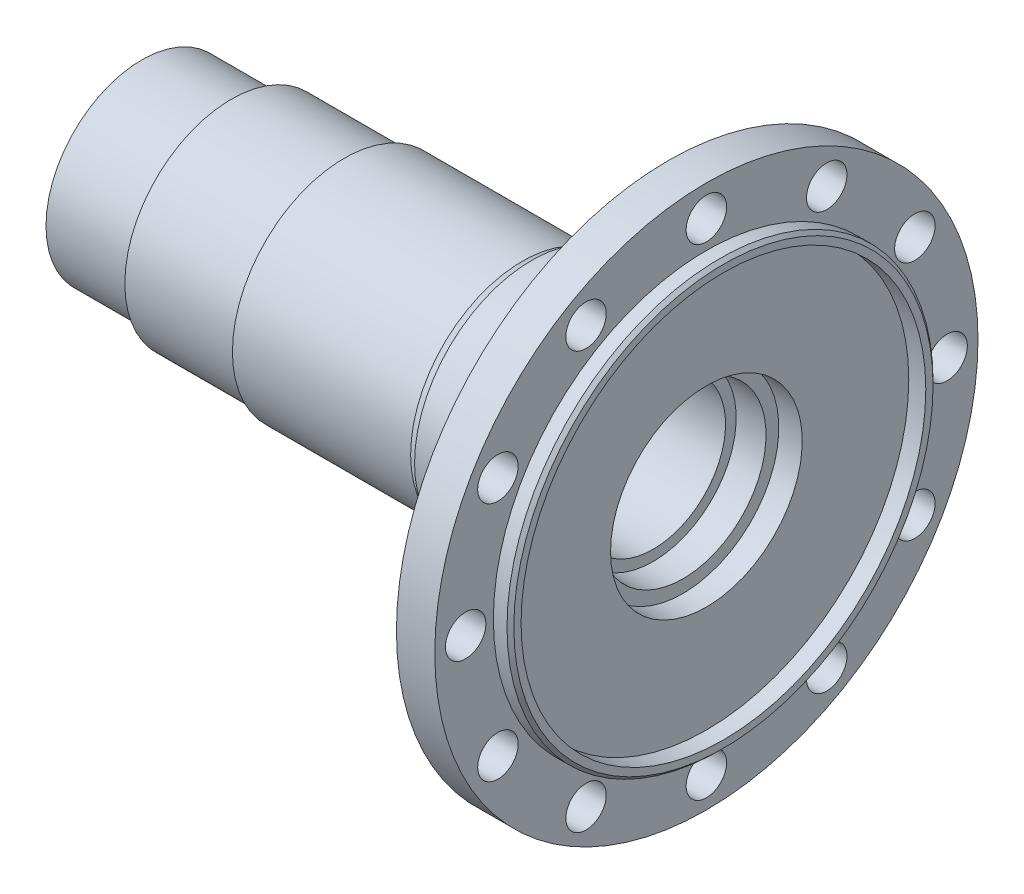
ISO-10303-21;
HEADER;
FILE_DESCRIPTION(('STEP AP214'),'2;1');
FILE_NAME('part.step','',(''),(''),'','','');
FILE_SCHEMA(('AUTOMOTIVE_DESIGN { 1 0 10303 214 1 1 1 1 }'));
ENDSEC;
DATA;
#1=APPLICATION_CONTEXT('core data for automotive mechanical design processes');
#2=APPLICATION_PROTOCOL_DEFINITION('international standard','automotive_design',2000,#1);
#3=PRODUCT_CONTEXT('',#1,'mechanical');
#4=PRODUCT('Part','Part','',(#3));
#5=PRODUCT_RELATED_PRODUCT_CATEGORY('part','',(#4));
#6=PRODUCT_DEFINITION_FORMATION('','',#4);
#7=PRODUCT_DEFINITION_CONTEXT('part definition',#1,'design');
#8=PRODUCT_DEFINITION('design','',#6,#7);
#9=PRODUCT_DEFINITION_SHAPE('','',#8);
#10=(LENGTH_UNIT() NAMED_UNIT(*) SI_UNIT(.MILLI.,.METRE.));
#11=(NAMED_UNIT(*) PLANE_ANGLE_UNIT() SI_UNIT($,.RADIAN.));
#12=(NAMED_UNIT(*) SI_UNIT($,.STERADIAN.) SOLID_ANGLE_UNIT());
#13=UNCERTAINTY_MEASURE_WITH_UNIT(LENGTH_MEASURE(1.E-05),#10,'distance_accuracy_value','');
#14=(GEOMETRIC_REPRESENTATION_CONTEXT(3) GLOBAL_UNCERTAINTY_ASSIGNED_CONTEXT((#13)) GLOBAL_UNIT_ASSIGNED_CONTEXT((#10,
#11,#12)) REPRESENTATION_CONTEXT('',''));
#15=CARTESIAN_POINT('',(0.,0.,0.));
#16=DIRECTION('',(0.,0.,1.));
#17=DIRECTION('',(1.,0.,0.));
#18=AXIS2_PLACEMENT_3D('',#15,#16,#17);
#19=CARTESIAN_POINT('',(0.,0.,0.));
#20=DIRECTION('',(1.,0.,0.));
#21=DIRECTION('',(0.,0.,-1.));
#22=AXIS2_PLACEMENT_3D('',#19,#20,#21);
#23=PLANE('',#22);
#24=CARTESIAN_POINT('',(0.,0.,0.));
#25=DIRECTION('',(-1.,0.,0.));
#26=DIRECTION('',(0.,0.,1.));
#27=AXIS2_PLACEMENT_3D('',#24,#25,#26);
#28=CIRCLE('',#27,31.);
#29=CARTESIAN_POINT('',(0.,0.,31.));
#30=VERTEX_POINT('',#29);
#31=EDGE_CURVE('E158',#30,#30,#28,.T.);
#32=ORIENTED_EDGE('',*,*,#31,.F.);
#33=EDGE_LOOP('',(#32));
#34=FACE_BOUND('',#33,.T.);
#35=CARTESIAN_POINT('',(0.,0.,0.));
#36=DIRECTION('',(-1.,0.,0.));
#37=DIRECTION('',(0.,0.,1.));
#38=AXIS2_PLACEMENT_3D('',#35,#36,#37);
#39=CIRCLE('',#38,45.);
#40=CARTESIAN_POINT('',(0.,0.,45.));
#41=VERTEX_POINT('',#40);
#42=EDGE_CURVE('E11',#41,#41,#39,.T.);
#43=ORIENTED_EDGE('',*,*,#42,.T.);
#44=EDGE_LOOP('',(#43));
#45=FACE_BOUND('',#44,.T.);
#46=ADVANCED_FACE('F50',(#34,#45),#23,.F.);
#47=CARTESIAN_POINT('',(0.,0.,0.));
#48=DIRECTION('',(-1.,0.,0.));
#49=DIRECTION('',(0.,0.,1.));
#50=AXIS2_PLACEMENT_3D('',#47,#48,#49);
#51=CYLINDRICAL_SURFACE('',#50,45.);
#52=ORIENTED_EDGE('',*,*,#42,.F.);
#53=EDGE_LOOP('',(#52));
#54=FACE_BOUND('',#53,.T.);
#55=CARTESIAN_POINT('',(42.,0.,0.));
#56=DIRECTION('',(-1.,0.,0.));
#57=DIRECTION('',(0.,0.,1.));
#58=AXIS2_PLACEMENT_3D('',#55,#56,#57);
#59=CIRCLE('',#58,45.);
#60=CARTESIAN_POINT('',(42.,0.,45.));
#61=VERTEX_POINT('',#60);
#62=EDGE_CURVE('E59',#61,#61,#59,.T.);
#63=ORIENTED_EDGE('',*,*,#62,.T.);
#64=EDGE_LOOP('',(#63));
#65=FACE_BOUND('',#64,.T.);
#66=ADVANCED_FACE('F344',(#54,#65),#51,.T.);
#67=CARTESIAN_POINT('',(42.,45.,0.));
#68=DIRECTION('',(1.,0.,0.));
#69=DIRECTION('',(0.,0.,-1.));
#70=AXIS2_PLACEMENT_3D('',#67,#68,#69);
#71=PLANE('',#70);
#72=ORIENTED_EDGE('',*,*,#62,.F.);
#73=EDGE_LOOP('',(#72));
#74=FACE_BOUND('',#73,.T.);
#75=CARTESIAN_POINT('',(42.,0.,0.));
#76=DIRECTION('',(-1.,0.,0.));
#77=DIRECTION('',(0.,0.,1.));
#78=AXIS2_PLACEMENT_3D('',#75,#76,#77);
#79=CIRCLE('',#78,50.);
#80=CARTESIAN_POINT('',(42.,0.,50.));
#81=VERTEX_POINT('',#80);
#82=EDGE_CURVE('E65',#81,#81,#79,.T.);
#83=ORIENTED_EDGE('',*,*,#82,.T.);
#84=EDGE_LOOP('',(#83));
#85=FACE_BOUND('',#84,.T.);
#86=ADVANCED_FACE('F348',(#74,#85),#71,.F.);
#87=CARTESIAN_POINT('',(0.,0.,0.));
#88=DIRECTION('',(-1.,0.,0.));
#89=DIRECTION('',(0.,0.,1.));
#90=AXIS2_PLACEMENT_3D('',#87,#88,#89);
#91=CYLINDRICAL_SURFACE('',#90,50.);
#92=ORIENTED_EDGE('',*,*,#82,.F.);
#93=EDGE_LOOP('',(#92));
#94=FACE_BOUND('',#93,.T.);
#95=CARTESIAN_POINT('',(95.,0.,0.));
#96=DIRECTION('',(-1.,0.,0.));
#97=DIRECTION('',(0.,0.,1.));
#98=AXIS2_PLACEMENT_3D('',#95,#96,#97);
#99=CIRCLE('',#98,50.);
#100=CARTESIAN_POINT('',(95.,0.,50.));
#101=VERTEX_POINT('',#100);
#102=EDGE_CURVE('E82',#101,#101,#99,.T.);
#103=ORIENTED_EDGE('',*,*,#102,.T.);
#104=EDGE_LOOP('',(#103));
#105=FACE_BOUND('',#104,.T.);
#106=ADVANCED_FACE('F473',(#94,#105),#91,.T.);
#107=CARTESIAN_POINT('',(95.,50.,0.));
#108=DIRECTION('',(1.,0.,0.));
#109=DIRECTION('',(0.,0.,-1.));
#110=AXIS2_PLACEMENT_3D('',#107,#108,#109);
#111=PLANE('',#110);
#112=ORIENTED_EDGE('',*,*,#102,.F.);
#113=EDGE_LOOP('',(#112));
#114=FACE_BOUND('',#113,.T.);
#115=CARTESIAN_POINT('',(95.,0.,0.));
#116=DIRECTION('',(-1.,0.,0.));
#117=DIRECTION('',(0.,0.,1.));
#118=AXIS2_PLACEMENT_3D('',#115,#116,#117);
#119=CIRCLE('',#118,52.5);
#120=CARTESIAN_POINT('',(95.,0.,52.5));
#121=VERTEX_POINT('',#120);
#122=EDGE_CURVE('E87',#121,#121,#119,.T.);
#123=ORIENTED_EDGE('',*,*,#122,.T.);
#124=EDGE_LOOP('',(#123));
#125=FACE_BOUND('',#124,.T.);
#126=ADVANCED_FACE('F468',(#114,#125),#111,.F.);
#127=CARTESIAN_POINT('',(0.,0.,0.));
#128=DIRECTION('',(-1.,0.,0.));
#129=DIRECTION('',(0.,0.,1.));
#130=AXIS2_PLACEMENT_3D('',#127,#128,#129);
#131=CYLINDRICAL_SURFACE('',#130,52.5);
#132=ORIENTED_EDGE('',*,*,#122,.F.);
#133=EDGE_LOOP('',(#132));
#134=FACE_BOUND('',#133,.T.);
#135=CARTESIAN_POINT('',(178.669872981078,0.,0.));
#136=DIRECTION('',(-1.,0.,0.));
#137=DIRECTION('',(0.,0.,1.));
#138=AXIS2_PLACEMENT_3D('',#135,#136,#137);
#139=CIRCLE('',#138,52.5);
#140=CARTESIAN_POINT('',(178.669872981078,0.,52.5));
#141=VERTEX_POINT('',#140);
#142=EDGE_CURVE('E92',#141,#141,#139,.T.);
#143=ORIENTED_EDGE('',*,*,#142,.T.);
#144=EDGE_LOOP('',(#143));
#145=FACE_BOUND('',#144,.T.);
#146=ADVANCED_FACE('F420',(#134,#145),#131,.T.);
#147=CARTESIAN_POINT('',(183.,0.,0.));
#148=DIRECTION('',(1.,0.,0.));
#149=DIRECTION('',(0.,0.,-1.));
#150=AXIS2_PLACEMENT_3D('',#147,#148,#149);
#151=CONICAL_SURFACE('',#150,55.,0.5235987755983);
#152=ORIENTED_EDGE('',*,*,#142,.F.);
#153=EDGE_LOOP('',(#152));
#154=FACE_BOUND('',#153,.T.);
#155=CARTESIAN_POINT('',(183.,0.,0.));
#156=DIRECTION('',(-1.,0.,0.));
#157=DIRECTION('',(0.,0.,1.));
#158=AXIS2_PLACEMENT_3D('',#155,#156,#157);
#159=CIRCLE('',#158,55.);
#160=CARTESIAN_POINT('',(183.,0.,55.));
#161=VERTEX_POINT('',#160);
#162=EDGE_CURVE('E100',#161,#161,#159,.T.);
#163=ORIENTED_EDGE('',*,*,#162,.T.);
#164=EDGE_LOOP('',(#163));
#165=FACE_BOUND('',#164,.T.);
#166=ADVANCED_FACE('F422',(#154,#165),#151,.T.);
#167=CARTESIAN_POINT('',(0.,0.,0.));
#168=DIRECTION('',(-1.,0.,0.));
#169=DIRECTION('',(0.,0.,1.));
#170=AXIS2_PLACEMENT_3D('',#167,#168,#169);
#171=CYLINDRICAL_SURFACE('',#170,55.);
#172=ORIENTED_EDGE('',*,*,#162,.F.);
#173=EDGE_LOOP('',(#172));
#174=FACE_BOUND('',#173,.T.);
#175=CARTESIAN_POINT('',(215.,0.,0.));
#176=DIRECTION('',(-1.,0.,0.));
#177=DIRECTION('',(0.,0.,1.));
#178=AXIS2_PLACEMENT_3D('',#175,#176,#177);
#179=CIRCLE('',#178,55.);
#180=CARTESIAN_POINT('',(215.,0.,55.));
#181=VERTEX_POINT('',#180);
#182=EDGE_CURVE('E104',#181,#181,#179,.T.);
#183=ORIENTED_EDGE('',*,*,#182,.T.);
#184=EDGE_LOOP('',(#183));
#185=FACE_BOUND('',#184,.T.);
#186=ADVANCED_FACE('F425',(#174,#185),#171,.T.);
#187=CARTESIAN_POINT('',(215.,55.,0.));
#188=DIRECTION('',(1.,0.,0.));
#189=DIRECTION('',(0.,0.,-1.));
#190=AXIS2_PLACEMENT_3D('',#187,#188,#189);
#191=PLANE('',#190);
#192=ORIENTED_EDGE('',*,*,#182,.F.);
#193=EDGE_LOOP('',(#192));
#194=FACE_BOUND('',#193,.T.);
#195=CARTESIAN_POINT('',(215.,0.,0.));
#196=DIRECTION('',(-1.,0.,0.));
#197=DIRECTION('',(0.,0.,1.));
#198=AXIS2_PLACEMENT_3D('',#195,#196,#197);
#199=CIRCLE('',#198,62.5);
#200=CARTESIAN_POINT('',(215.,0.,62.5));
#201=VERTEX_POINT('',#200);
#202=EDGE_CURVE('E109',#201,#201,#199,.T.);
#203=ORIENTED_EDGE('',*,*,#202,.T.);
#204=EDGE_LOOP('',(#203));
#205=FACE_BOUND('',#204,.T.);
#206=ADVANCED_FACE('F431',(#194,#205),#191,.F.);
#207=CARTESIAN_POINT('',(0.,0.,0.));
#208=DIRECTION('',(-1.,0.,0.));
#209=DIRECTION('',(0.,0.,1.));
#210=AXIS2_PLACEMENT_3D('',#207,#208,#209);
#211=CYLINDRICAL_SURFACE('',#210,62.5);
#212=ORIENTED_EDGE('',*,*,#202,.F.);
#213=EDGE_LOOP('',(#212));
#214=FACE_BOUND('',#213,.T.);
#215=CARTESIAN_POINT('',(239.,0.,0.));
#216=DIRECTION('',(-1.,0.,0.));
#217=DIRECTION('',(0.,0.,1.));
#218=AXIS2_PLACEMENT_3D('',#215,#216,#217);
#219=CIRCLE('',#218,62.5);
#220=CARTESIAN_POINT('',(239.,0.,62.5));
#221=VERTEX_POINT('',#220);
#222=EDGE_CURVE('E114',#221,#221,#219,.T.);
#223=ORIENTED_EDGE('',*,*,#222,.T.);
#224=EDGE_LOOP('',(#223));
#225=FACE_BOUND('',#224,.T.);
#226=ADVANCED_FACE('F437',(#214,#225),#211,.T.);
#227=CARTESIAN_POINT('',(239.,62.5,0.));
#228=DIRECTION('',(1.,0.,0.));
#229=DIRECTION('',(0.,0.,-1.));
#230=AXIS2_PLACEMENT_3D('',#227,#228,#229);
#231=PLANE('',#230);
#232=ORIENTED_EDGE('',*,*,#222,.F.);
#233=EDGE_LOOP('',(#232));
#234=FACE_BOUND('',#233,.T.);
#235=CARTESIAN_POINT('',(239.,0.,0.));
#236=DIRECTION('',(-1.,0.,0.));
#237=DIRECTION('',(0.,0.,1.));
#238=AXIS2_PLACEMENT_3D('',#235,#236,#237);
#239=CIRCLE('',#238,100.);
#240=CARTESIAN_POINT('',(239.,0.,100.));
#241=VERTEX_POINT('',#240);
#242=EDGE_CURVE('E122',#241,#241,#239,.T.);
#243=ORIENTED_EDGE('',*,*,#242,.T.);
#244=EDGE_LOOP('',(#243));
#245=FACE_BOUND('',#244,.T.);
#246=ADVANCED_FACE('F443',(#234,#245),#231,.F.);
#247=CARTESIAN_POINT('',(0.,0.,0.));
#248=DIRECTION('',(-1.,0.,0.));
#249=DIRECTION('',(0.,0.,1.));
#250=AXIS2_PLACEMENT_3D('',#247,#248,#249);
#251=CYLINDRICAL_SURFACE('',#250,100.);
#252=ORIENTED_EDGE('',*,*,#242,.F.);
#253=EDGE_LOOP('',(#252));
#254=FACE_BOUND('',#253,.T.);
#255=CARTESIAN_POINT('',(247.,0.,0.));
#256=DIRECTION('',(-1.,0.,0.));
#257=DIRECTION('',(0.,0.,1.));
#258=AXIS2_PLACEMENT_3D('',#255,#256,#257);
#259=CIRCLE('',#258,100.);
#260=CARTESIAN_POINT('',(247.,0.,100.));
#261=VERTEX_POINT('',#260);
#262=EDGE_CURVE('E126',#261,#261,#259,.T.);
#263=ORIENTED_EDGE('',*,*,#262,.T.);
#264=EDGE_LOOP('',(#263));
#265=FACE_BOUND('',#264,.T.);
#266=ADVANCED_FACE('F385',(#254,#265),#251,.T.);
#267=CARTESIAN_POINT('',(247.,100.,0.));
#268=DIRECTION('',(1.,0.,0.));
#269=DIRECTION('',(0.,0.,-1.));
#270=AXIS2_PLACEMENT_3D('',#267,#268,#269);
#271=PLANE('',#270);
#272=CARTESIAN_POINT('',(247.,97.8608706276416,-56.5));
#273=DIRECTION('',(1.,0.,0.));
#274=DIRECTION('',(0.,0.,-1.));
#275=AXIS2_PLACEMENT_3D('',#272,#273,#274);
#276=CIRCLE('',#275,9.5);
#277=CARTESIAN_POINT('',(247.,97.8608706276416,-66.));
#278=VERTEX_POINT('',#277);
#279=EDGE_CURVE('E265',#278,#278,#276,.F.);
#280=ORIENTED_EDGE('',*,*,#279,.F.);
#281=EDGE_LOOP('',(#280));
#282=FACE_BOUND('',#281,.T.);
#283=CARTESIAN_POINT('',(247.,56.4999999999999,-97.8608706276416));
#284=DIRECTION('',(1.,0.,0.));
#285=DIRECTION('',(0.,0.,-1.));
#286=AXIS2_PLACEMENT_3D('',#283,#284,#285);
#287=CIRCLE('',#286,9.49999999999999);
#288=CARTESIAN_POINT('',(247.,56.4999999999999,-107.360870627642));
#289=VERTEX_POINT('',#288);
#290=EDGE_CURVE('E260',#289,#289,#287,.F.);
#291=ORIENTED_EDGE('',*,*,#290,.F.);
#292=EDGE_LOOP('',(#291));
#293=FACE_BOUND('',#292,.T.);
#294=CARTESIAN_POINT('',(247.,0.,-113.));
#295=DIRECTION('',(1.,0.,0.));
#296=DIRECTION('',(0.,0.,-1.));
#297=AXIS2_PLACEMENT_3D('',#294,#295,#296);
#298=CIRCLE('',#297,9.49999999999999);
#299=CARTESIAN_POINT('',(247.,0.,-122.5));
#300=VERTEX_POINT('',#299);
#301=EDGE_CURVE('E255',#300,#300,#298,.F.);
#302=ORIENTED_EDGE('',*,*,#301,.F.);
#303=EDGE_LOOP('',(#302));
#304=FACE_BOUND('',#303,.T.);
#305=CARTESIAN_POINT('',(247.,-56.5,-97.8608706276415));
#306=DIRECTION('',(1.,0.,0.));
#307=DIRECTION('',(0.,0.,-1.));
#308=AXIS2_PLACEMENT_3D('',#305,#306,#307);
#309=CIRCLE('',#308,9.49999999999999);
#310=CARTESIAN_POINT('',(247.,-56.5,-107.360870627642));
#311=VERTEX_POINT('',#310);
#312=EDGE_CURVE('E250',#311,#311,#309,.F.);
#313=ORIENTED_EDGE('',*,*,#312,.F.);
#314=EDGE_LOOP('',(#313));
#315=FACE_BOUND('',#314,.T.);
#316=CARTESIAN_POINT('',(247.,-97.8608706276416,-56.5));
#317=DIRECTION('',(1.,0.,0.));
#318=DIRECTION('',(0.,0.,-1.));
#319=AXIS2_PLACEMENT_3D('',#316,#317,#318);
#320=CIRCLE('',#319,9.5);
#321=CARTESIAN_POINT('',(247.,-97.8608706276416,-66.));
#322=VERTEX_POINT('',#321);
#323=EDGE_CURVE('E245',#322,#322,#320,.F.);
#324=ORIENTED_EDGE('',*,*,#323,.F.);
#325=EDGE_LOOP('',(#324));
#326=FACE_BOUND('',#325,.T.);
#327=CARTESIAN_POINT('',(247.,-113.,0.));
#328=DIRECTION('',(1.,0.,0.));
#329=DIRECTION('',(0.,0.,-1.));
#330=AXIS2_PLACEMENT_3D('',#327,#328,#329);
#331=CIRCLE('',#330,9.5);
#332=CARTESIAN_POINT('',(247.,-113.,-9.49999999999998));
#333=VERTEX_POINT('',#332);
#334=EDGE_CURVE('E240',#333,#333,#331,.F.);
#335=ORIENTED_EDGE('',*,*,#334,.F.);
#336=EDGE_LOOP('',(#335));
#337=FACE_BOUND('',#336,.T.);
#338=CARTESIAN_POINT('',(247.,-97.8608706276415,56.5));
#339=DIRECTION('',(1.,0.,0.));
#340=DIRECTION('',(0.,0.,-1.));
#341=AXIS2_PLACEMENT_3D('',#338,#339,#340);
#342=CIRCLE('',#341,9.5);
#343=CARTESIAN_POINT('',(247.,-97.8608706276415,47.));
#344=VERTEX_POINT('',#343);
#345=EDGE_CURVE('E235',#344,#344,#342,.F.);
#346=ORIENTED_EDGE('',*,*,#345,.F.);
#347=EDGE_LOOP('',(#346));
#348=FACE_BOUND('',#347,.T.);
#349=CARTESIAN_POINT('',(247.,-56.5,97.8608706276416));
#350=DIRECTION('',(1.,0.,0.));
#351=DIRECTION('',(0.,0.,-1.));
#352=AXIS2_PLACEMENT_3D('',#349,#350,#351);
#353=CIRCLE('',#352,9.49999999999999);
#354=CARTESIAN_POINT('',(247.,-56.5,88.3608706276416));
#355=VERTEX_POINT('',#354);
#356=EDGE_CURVE('E230',#355,#355,#353,.F.);
#357=ORIENTED_EDGE('',*,*,#356,.F.);
#358=EDGE_LOOP('',(#357));
#359=FACE_BOUND('',#358,.T.);
#360=CARTESIAN_POINT('',(247.,0.,113.));
#361=DIRECTION('',(1.,0.,0.));
#362=DIRECTION('',(0.,0.,-1.));
#363=AXIS2_PLACEMENT_3D('',#360,#361,#362);
#364=CIRCLE('',#363,9.49999999999999);
#365=CARTESIAN_POINT('',(247.,0.,103.5));
#366=VERTEX_POINT('',#365);
#367=EDGE_CURVE('E225',#366,#366,#364,.F.);
#368=ORIENTED_EDGE('',*,*,#367,.F.);
#369=EDGE_LOOP('',(#368));
#370=FACE_BOUND('',#369,.T.);
#371=CARTESIAN_POINT('',(247.,56.5,97.8608706276416));
#372=DIRECTION('',(1.,0.,0.));
#373=DIRECTION('',(0.,0.,-1.));
#374=AXIS2_PLACEMENT_3D('',#371,#372,#373);
#375=CIRCLE('',#374,9.49999999999999);
#376=CARTESIAN_POINT('',(247.,56.5,88.3608706276416));
#377=VERTEX_POINT('',#376);
#378=EDGE_CURVE('E220',#377,#377,#375,.F.);
#379=ORIENTED_EDGE('',*,*,#378,.F.);
#380=EDGE_LOOP('',(#379));
#381=FACE_BOUND('',#380,.T.);
#382=CARTESIAN_POINT('',(247.,97.8608706276416,56.5));
#383=DIRECTION('',(1.,0.,0.));
#384=DIRECTION('',(0.,0.,-1.));
#385=AXIS2_PLACEMENT_3D('',#382,#383,#384);
#386=CIRCLE('',#385,9.5);
#387=CARTESIAN_POINT('',(247.,97.8608706276416,47.));
#388=VERTEX_POINT('',#387);
#389=EDGE_CURVE('E215',#388,#388,#386,.F.);
#390=ORIENTED_EDGE('',*,*,#389,.F.);
#391=EDGE_LOOP('',(#390));
#392=FACE_BOUND('',#391,.T.);
#393=CARTESIAN_POINT('',(247.,113.,0.));
#394=DIRECTION('',(1.,0.,0.));
#395=DIRECTION('',(0.,0.,-1.));
#396=AXIS2_PLACEMENT_3D('',#393,#394,#395);
#397=CIRCLE('',#396,9.5);
#398=CARTESIAN_POINT('',(247.,113.,-9.50000000000001));
#399=VERTEX_POINT('',#398);
#400=EDGE_CURVE('E211',#399,#399,#397,.F.);
#401=ORIENTED_EDGE('',*,*,#400,.F.);
#402=EDGE_LOOP('',(#401));
#403=FACE_BOUND('',#402,.T.);
#404=ORIENTED_EDGE('',*,*,#262,.F.);
#405=EDGE_LOOP('',(#404));
#406=FACE_BOUND('',#405,.T.);
#407=CARTESIAN_POINT('',(247.,0.,0.));
#408=DIRECTION('',(-1.,0.,0.));
#409=DIRECTION('',(0.,0.,1.));
#410=AXIS2_PLACEMENT_3D('',#407,#408,#409);
#411=CIRCLE('',#410,127.5);
#412=CARTESIAN_POINT('',(247.,0.,127.5));
#413=VERTEX_POINT('',#412);
#414=EDGE_CURVE('E131',#413,#413,#411,.T.);
#415=ORIENTED_EDGE('',*,*,#414,.T.);
#416=EDGE_LOOP('',(#415));
#417=FACE_BOUND('',#416,.T.);
#418=ADVANCED_FACE('F382',(#282,#293,#304,#315,#326,#337,#348,#359,#370,#381,#392,#403,#406,
#417),#271,.F.);
#419=CARTESIAN_POINT('',(0.,0.,0.));
#420=DIRECTION('',(-1.,0.,0.));
#421=DIRECTION('',(0.,0.,1.));
#422=AXIS2_PLACEMENT_3D('',#419,#420,#421);
#423=CYLINDRICAL_SURFACE('',#422,127.5);
#424=ORIENTED_EDGE('',*,*,#414,.F.);
#425=EDGE_LOOP('',(#424));
#426=FACE_BOUND('',#425,.T.);
#427=CARTESIAN_POINT('',(265.,0.,0.));
#428=DIRECTION('',(-1.,0.,0.));
#429=DIRECTION('',(0.,0.,1.));
#430=AXIS2_PLACEMENT_3D('',#427,#428,#429);
#431=CIRCLE('',#430,127.5);
#432=CARTESIAN_POINT('',(265.,0.,127.5));
#433=VERTEX_POINT('',#432);
#434=EDGE_CURVE('E136',#433,#433,#431,.T.);
#435=ORIENTED_EDGE('',*,*,#434,.T.);
#436=EDGE_LOOP('',(#435));
#437=FACE_BOUND('',#436,.T.);
#438=ADVANCED_FACE('F282',(#426,#437),#423,.T.);
#439=CARTESIAN_POINT('',(265.,127.5,0.));
#440=DIRECTION('',(-1.,0.,0.));
#441=DIRECTION('',(0.,0.,1.));
#442=AXIS2_PLACEMENT_3D('',#439,#440,#441);
#443=PLANE('',#442);
#444=CARTESIAN_POINT('',(265.,97.8608706276416,-56.5));
#445=DIRECTION('',(-1.,0.,0.));
#446=DIRECTION('',(0.,0.,1.));
#447=AXIS2_PLACEMENT_3D('',#444,#445,#446);
#448=CIRCLE('',#447,9.5);
#449=CARTESIAN_POINT('',(265.,97.8608706276416,-47.));
#450=VERTEX_POINT('',#449);
#451=EDGE_CURVE('E54',#450,#450,#448,.F.);
#452=ORIENTED_EDGE('',*,*,#451,.F.);
#453=EDGE_LOOP('',(#452));
#454=FACE_BOUND('',#453,.T.);
#455=CARTESIAN_POINT('',(265.,56.4999999999999,-97.8608706276416));
#456=DIRECTION('',(-1.,0.,0.));
#457=DIRECTION('',(0.,0.,1.));
#458=AXIS2_PLACEMENT_3D('',#455,#456,#457);
#459=CIRCLE('',#458,9.49999999999999);
#460=CARTESIAN_POINT('',(265.,56.4999999999999,-88.3608706276416));
#461=VERTEX_POINT('',#460);
#462=EDGE_CURVE('E264',#461,#461,#459,.F.);
#463=ORIENTED_EDGE('',*,*,#462,.F.);
#464=EDGE_LOOP('',(#463));
#465=FACE_BOUND('',#464,.T.);
#466=CARTESIAN_POINT('',(265.,0.,-113.));
#467=DIRECTION('',(-1.,0.,0.));
#468=DIRECTION('',(0.,0.,1.));
#469=AXIS2_PLACEMENT_3D('',#466,#467,#468);
#470=CIRCLE('',#469,9.49999999999999);
#471=CARTESIAN_POINT('',(265.,0.,-103.5));
#472=VERTEX_POINT('',#471);
#473=EDGE_CURVE('E259',#472,#472,#470,.F.);
#474=ORIENTED_EDGE('',*,*,#473,.F.);
#475=EDGE_LOOP('',(#474));
#476=FACE_BOUND('',#475,.T.);
#477=CARTESIAN_POINT('',(265.,-56.5,-97.8608706276415));
#478=DIRECTION('',(-1.,0.,0.));
#479=DIRECTION('',(0.,0.,1.));
#480=AXIS2_PLACEMENT_3D('',#477,#478,#479);
#481=CIRCLE('',#480,9.49999999999999);
#482=CARTESIAN_POINT('',(265.,-56.5,-88.3608706276415));
#483=VERTEX_POINT('',#482);
#484=EDGE_CURVE('E254',#483,#483,#481,.F.);
#485=ORIENTED_EDGE('',*,*,#484,.F.);
#486=EDGE_LOOP('',(#485));
#487=FACE_BOUND('',#486,.T.);
#488=CARTESIAN_POINT('',(265.,-97.8608706276416,-56.5));
#489=DIRECTION('',(-1.,0.,0.));
#490=DIRECTION('',(0.,0.,1.));
#491=AXIS2_PLACEMENT_3D('',#488,#489,#490);
#492=CIRCLE('',#491,9.5);
#493=CARTESIAN_POINT('',(265.,-97.8608706276416,-47.));
#494=VERTEX_POINT('',#493);
#495=EDGE_CURVE('E249',#494,#494,#492,.F.);
#496=ORIENTED_EDGE('',*,*,#495,.F.);
#497=EDGE_LOOP('',(#496));
#498=FACE_BOUND('',#497,.T.);
#499=CARTESIAN_POINT('',(265.,-113.,0.));
#500=DIRECTION('',(-1.,0.,0.));
#501=DIRECTION('',(0.,0.,1.));
#502=AXIS2_PLACEMENT_3D('',#499,#500,#501);
#503=CIRCLE('',#502,9.5);
#504=CARTESIAN_POINT('',(265.,-113.,9.50000000000002));
#505=VERTEX_POINT('',#504);
#506=EDGE_CURVE('E244',#505,#505,#503,.F.);
#507=ORIENTED_EDGE('',*,*,#506,.F.);
#508=EDGE_LOOP('',(#507));
#509=FACE_BOUND('',#508,.T.);
#510=CARTESIAN_POINT('',(265.,-97.8608706276415,56.5));
#511=DIRECTION('',(-1.,0.,0.));
#512=DIRECTION('',(0.,0.,1.));
#513=AXIS2_PLACEMENT_3D('',#510,#511,#512);
#514=CIRCLE('',#513,9.5);
#515=CARTESIAN_POINT('',(265.,-97.8608706276415,66.0000000000001));
#516=VERTEX_POINT('',#515);
#517=EDGE_CURVE('E239',#516,#516,#514,.F.);
#518=ORIENTED_EDGE('',*,*,#517,.F.);
#519=EDGE_LOOP('',(#518));
#520=FACE_BOUND('',#519,.T.);
#521=CARTESIAN_POINT('',(265.,-56.5,97.8608706276416));
#522=DIRECTION('',(-1.,0.,0.));
#523=DIRECTION('',(0.,0.,1.));
#524=AXIS2_PLACEMENT_3D('',#521,#522,#523);
#525=CIRCLE('',#524,9.49999999999999);
#526=CARTESIAN_POINT('',(265.,-56.5,107.360870627642));
#527=VERTEX_POINT('',#526);
#528=EDGE_CURVE('E234',#527,#527,#525,.F.);
#529=ORIENTED_EDGE('',*,*,#528,.F.);
#530=EDGE_LOOP('',(#529));
#531=FACE_BOUND('',#530,.T.);
#532=CARTESIAN_POINT('',(265.,0.,113.));
#533=DIRECTION('',(-1.,0.,0.));
#534=DIRECTION('',(0.,0.,1.));
#535=AXIS2_PLACEMENT_3D('',#532,#533,#534);
#536=CIRCLE('',#535,9.49999999999999);
#537=CARTESIAN_POINT('',(265.,0.,122.5));
#538=VERTEX_POINT('',#537);
#539=EDGE_CURVE('E229',#538,#538,#536,.F.);
#540=ORIENTED_EDGE('',*,*,#539,.F.);
#541=EDGE_LOOP('',(#540));
#542=FACE_BOUND('',#541,.T.);
#543=CARTESIAN_POINT('',(265.,56.5,97.8608706276416));
#544=DIRECTION('',(-1.,0.,0.));
#545=DIRECTION('',(0.,0.,1.));
#546=AXIS2_PLACEMENT_3D('',#543,#544,#545);
#547=CIRCLE('',#546,9.49999999999999);
#548=CARTESIAN_POINT('',(265.,56.5,107.360870627642));
#549=VERTEX_POINT('',#548);
#550=EDGE_CURVE('E224',#549,#549,#547,.F.);
#551=ORIENTED_EDGE('',*,*,#550,.F.);
#552=EDGE_LOOP('',(#551));
#553=FACE_BOUND('',#552,.T.);
#554=CARTESIAN_POINT('',(265.,97.8608706276416,56.5));
#555=DIRECTION('',(-1.,0.,0.));
#556=DIRECTION('',(0.,0.,1.));
#557=AXIS2_PLACEMENT_3D('',#554,#555,#556);
#558=CIRCLE('',#557,9.5);
#559=CARTESIAN_POINT('',(265.,97.8608706276416,66.));
#560=VERTEX_POINT('',#559);
#561=EDGE_CURVE('E219',#560,#560,#558,.F.);
#562=ORIENTED_EDGE('',*,*,#561,.F.);
#563=EDGE_LOOP('',(#562));
#564=FACE_BOUND('',#563,.T.);
#565=CARTESIAN_POINT('',(265.,113.,0.));
#566=DIRECTION('',(-1.,0.,0.));
#567=DIRECTION('',(0.,0.,1.));
#568=AXIS2_PLACEMENT_3D('',#565,#566,#567);
#569=CIRCLE('',#568,9.5);
#570=CARTESIAN_POINT('',(265.,113.,9.49999999999999));
#571=VERTEX_POINT('',#570);
#572=EDGE_CURVE('E71',#571,#571,#569,.F.);
#573=ORIENTED_EDGE('',*,*,#572,.F.);
#574=EDGE_LOOP('',(#573));
#575=FACE_BOUND('',#574,.T.);
#576=ORIENTED_EDGE('',*,*,#434,.F.);
#577=EDGE_LOOP('',(#576));
#578=FACE_BOUND('',#577,.T.);
#579=CARTESIAN_POINT('',(265.,0.,0.));
#580=DIRECTION('',(-1.,0.,0.));
#581=DIRECTION('',(0.,0.,1.));
#582=AXIS2_PLACEMENT_3D('',#579,#580,#581);
#583=CIRCLE('',#582,100.);
#584=CARTESIAN_POINT('',(265.,0.,100.));
#585=VERTEX_POINT('',#584);
#586=EDGE_CURVE('E144',#585,#585,#583,.T.);
#587=ORIENTED_EDGE('',*,*,#586,.T.);
#588=EDGE_LOOP('',(#587));
#589=FACE_BOUND('',#588,.T.);
#590=ADVANCED_FACE('F278',(#454,#465,#476,#487,#498,#509,#520,#531,#542,#553,#564,#575,#578,
#589),#443,.F.);
#591=CARTESIAN_POINT('',(0.,0.,0.));
#592=DIRECTION('',(-1.,0.,0.));
#593=DIRECTION('',(0.,0.,1.));
#594=AXIS2_PLACEMENT_3D('',#591,#592,#593);
#595=CYLINDRICAL_SURFACE('',#594,100.);
#596=ORIENTED_EDGE('',*,*,#586,.F.);
#597=EDGE_LOOP('',(#596));
#598=FACE_BOUND('',#597,.T.);
#599=CARTESIAN_POINT('',(271.4,0.,0.));
#600=DIRECTION('',(-1.,0.,0.));
#601=DIRECTION('',(0.,0.,1.));
#602=AXIS2_PLACEMENT_3D('',#599,#600,#601);
#603=CIRCLE('',#602,100.);
#604=CARTESIAN_POINT('',(271.4,0.,100.));
#605=VERTEX_POINT('',#604);
#606=EDGE_CURVE('E148',#605,#605,#603,.T.);
#607=ORIENTED_EDGE('',*,*,#606,.T.);
#608=EDGE_LOOP('',(#607));
#609=FACE_BOUND('',#608,.T.);
#610=ADVANCED_FACE('F281',(#598,#609),#595,.T.);
#611=CARTESIAN_POINT('',(273.,0.,0.));
#612=DIRECTION('',(-1.,0.,0.));
#613=DIRECTION('',(0.,0.,1.));
#614=AXIS2_PLACEMENT_3D('',#611,#612,#613);
#615=CONICAL_SURFACE('',#614,98.4,0.785398163397435);
#616=ORIENTED_EDGE('',*,*,#606,.F.);
#617=EDGE_LOOP('',(#616));
#618=FACE_BOUND('',#617,.T.);
#619=CARTESIAN_POINT('',(273.,0.,0.));
#620=DIRECTION('',(-1.,0.,0.));
#621=DIRECTION('',(0.,0.,1.));
#622=AXIS2_PLACEMENT_3D('',#619,#620,#621);
#623=CIRCLE('',#622,98.4);
#624=CARTESIAN_POINT('',(273.,0.,98.4));
#625=VERTEX_POINT('',#624);
#626=EDGE_CURVE('E153',#625,#625,#623,.T.);
#627=ORIENTED_EDGE('',*,*,#626,.T.);
#628=EDGE_LOOP('',(#627));
#629=FACE_BOUND('',#628,.T.);
#630=ADVANCED_FACE('F323',(#618,#629),#615,.T.);
#631=CARTESIAN_POINT('',(273.,98.4,0.));
#632=DIRECTION('',(-1.,0.,0.));
#633=DIRECTION('',(0.,0.,1.));
#634=AXIS2_PLACEMENT_3D('',#631,#632,#633);
#635=PLANE('',#634);
#636=CARTESIAN_POINT('',(273.,0.,0.));
#637=DIRECTION('',(-1.,0.,0.));
#638=DIRECTION('',(0.,0.,1.));
#639=AXIS2_PLACEMENT_3D('',#636,#637,#638);
#640=CIRCLE('',#639,95.);
#641=CARTESIAN_POINT('',(273.,0.,95.));
#642=VERTEX_POINT('',#641);
#643=EDGE_CURVE('E206',#642,#642,#640,.T.);
#644=ORIENTED_EDGE('',*,*,#643,.T.);
#645=EDGE_LOOP('',(#644));
#646=FACE_BOUND('',#645,.T.);
#647=ORIENTED_EDGE('',*,*,#626,.F.);
#648=EDGE_LOOP('',(#647));
#649=FACE_BOUND('',#648,.T.);
#650=ADVANCED_FACE('F329',(#646,#649),#635,.F.);
#651=CARTESIAN_POINT('',(0.,0.,0.));
#652=DIRECTION('',(-1.,0.,0.));
#653=DIRECTION('',(0.,0.,1.));
#654=AXIS2_PLACEMENT_3D('',#651,#652,#653);
#655=CYLINDRICAL_SURFACE('',#654,31.);
#656=ORIENTED_EDGE('',*,*,#31,.T.);
#657=EDGE_LOOP('',(#656));
#658=FACE_BOUND('',#657,.T.);
#659=CARTESIAN_POINT('',(203.5,0.,0.));
#660=DIRECTION('',(-1.,0.,0.));
#661=DIRECTION('',(0.,0.,1.));
#662=AXIS2_PLACEMENT_3D('',#659,#660,#661);
#663=CIRCLE('',#662,31.);
#664=CARTESIAN_POINT('',(203.5,0.,31.));
#665=VERTEX_POINT('',#664);
#666=EDGE_CURVE('E166',#665,#665,#663,.T.);
#667=ORIENTED_EDGE('',*,*,#666,.F.);
#668=EDGE_LOOP('',(#667));
#669=FACE_BOUND('',#668,.T.);
#670=ADVANCED_FACE('F334',(#658,#669),#655,.F.);
#671=CARTESIAN_POINT('',(203.5,31.,0.));
#672=DIRECTION('',(1.,0.,0.));
#673=DIRECTION('',(0.,0.,-1.));
#674=AXIS2_PLACEMENT_3D('',#671,#672,#673);
#675=PLANE('',#674);
#676=ORIENTED_EDGE('',*,*,#666,.T.);
#677=EDGE_LOOP('',(#676));
#678=FACE_BOUND('',#677,.T.);
#679=CARTESIAN_POINT('',(203.5,0.,0.));
#680=DIRECTION('',(-1.,0.,0.));
#681=DIRECTION('',(0.,0.,1.));
#682=AXIS2_PLACEMENT_3D('',#679,#680,#681);
#683=CIRCLE('',#682,34.);
#684=CARTESIAN_POINT('',(203.5,0.,34.));
#685=VERTEX_POINT('',#684);
#686=EDGE_CURVE('E170',#685,#685,#683,.T.);
#687=ORIENTED_EDGE('',*,*,#686,.F.);
#688=EDGE_LOOP('',(#687));
#689=FACE_BOUND('',#688,.T.);
#690=ADVANCED_FACE('F339',(#678,#689),#675,.T.);
#691=CARTESIAN_POINT('',(0.,0.,0.));
#692=DIRECTION('',(-1.,0.,0.));
#693=DIRECTION('',(0.,0.,1.));
#694=AXIS2_PLACEMENT_3D('',#691,#692,#693);
#695=CYLINDRICAL_SURFACE('',#694,34.);
#696=ORIENTED_EDGE('',*,*,#686,.T.);
#697=EDGE_LOOP('',(#696));
#698=FACE_BOUND('',#697,.T.);
#699=CARTESIAN_POINT('',(240.,0.,0.));
#700=DIRECTION('',(-1.,0.,0.));
#701=DIRECTION('',(0.,0.,1.));
#702=AXIS2_PLACEMENT_3D('',#699,#700,#701);
#703=CIRCLE('',#702,34.);
#704=CARTESIAN_POINT('',(240.,0.,34.));
#705=VERTEX_POINT('',#704);
#706=EDGE_CURVE('E175',#705,#705,#703,.T.);
#707=ORIENTED_EDGE('',*,*,#706,.F.);
#708=EDGE_LOOP('',(#707));
#709=FACE_BOUND('',#708,.T.);
#710=ADVANCED_FACE('F568',(#698,#709),#695,.F.);
#711=CARTESIAN_POINT('',(240.,34.,0.));
#712=DIRECTION('',(1.,0.,0.));
#713=DIRECTION('',(0.,0.,-1.));
#714=AXIS2_PLACEMENT_3D('',#711,#712,#713);
#715=PLANE('',#714);
#716=ORIENTED_EDGE('',*,*,#706,.T.);
#717=EDGE_LOOP('',(#716));
#718=FACE_BOUND('',#717,.T.);
#719=CARTESIAN_POINT('',(240.,0.,0.));
#720=DIRECTION('',(-1.,0.,0.));
#721=DIRECTION('',(0.,0.,1.));
#722=AXIS2_PLACEMENT_3D('',#719,#720,#721);
#723=CIRCLE('',#722,39.);
#724=CARTESIAN_POINT('',(240.,0.,39.));
#725=VERTEX_POINT('',#724);
#726=EDGE_CURVE('E180',#725,#725,#723,.T.);
#727=ORIENTED_EDGE('',*,*,#726,.F.);
#728=EDGE_LOOP('',(#727));
#729=FACE_BOUND('',#728,.T.);
#730=ADVANCED_FACE('F578',(#718,#729),#715,.T.);
#731=CARTESIAN_POINT('',(0.,0.,0.));
#732=DIRECTION('',(-1.,0.,0.));
#733=DIRECTION('',(0.,0.,1.));
#734=AXIS2_PLACEMENT_3D('',#731,#732,#733);
#735=CYLINDRICAL_SURFACE('',#734,39.);
#736=ORIENTED_EDGE('',*,*,#726,.T.);
#737=EDGE_LOOP('',(#736));
#738=FACE_BOUND('',#737,.T.);
#739=CARTESIAN_POINT('',(254.,0.,0.));
#740=DIRECTION('',(-1.,0.,0.));
#741=DIRECTION('',(0.,0.,1.));
#742=AXIS2_PLACEMENT_3D('',#739,#740,#741);
#743=CIRCLE('',#742,39.);
#744=CARTESIAN_POINT('',(254.,0.,39.));
#745=VERTEX_POINT('',#744);
#746=EDGE_CURVE('E188',#745,#745,#743,.T.);
#747=ORIENTED_EDGE('',*,*,#746,.F.);
#748=EDGE_LOOP('',(#747));
#749=FACE_BOUND('',#748,.T.);
#750=ADVANCED_FACE('F588',(#738,#749),#735,.F.);
#751=CARTESIAN_POINT('',(254.,39.,0.));
#752=DIRECTION('',(1.,0.,0.));
#753=DIRECTION('',(0.,0.,-1.));
#754=AXIS2_PLACEMENT_3D('',#751,#752,#753);
#755=PLANE('',#754);
#756=ORIENTED_EDGE('',*,*,#746,.T.);
#757=EDGE_LOOP('',(#756));
#758=FACE_BOUND('',#757,.T.);
#759=CARTESIAN_POINT('',(254.,0.,0.));
#760=DIRECTION('',(-1.,0.,0.));
#761=DIRECTION('',(0.,0.,1.));
#762=AXIS2_PLACEMENT_3D('',#759,#760,#761);
#763=CIRCLE('',#762,45.);
#764=CARTESIAN_POINT('',(254.,0.,45.));
#765=VERTEX_POINT('',#764);
#766=EDGE_CURVE('E192',#765,#765,#763,.T.);
#767=ORIENTED_EDGE('',*,*,#766,.F.);
#768=EDGE_LOOP('',(#767));
#769=FACE_BOUND('',#768,.T.);
#770=ADVANCED_FACE('F598',(#758,#769),#755,.T.);
#771=CARTESIAN_POINT('',(0.,0.,0.));
#772=DIRECTION('',(-1.,0.,0.));
#773=DIRECTION('',(0.,0.,1.));
#774=AXIS2_PLACEMENT_3D('',#771,#772,#773);
#775=CYLINDRICAL_SURFACE('',#774,45.);
#776=ORIENTED_EDGE('',*,*,#766,.T.);
#777=EDGE_LOOP('',(#776));
#778=FACE_BOUND('',#777,.T.);
#779=CARTESIAN_POINT('',(265.,0.,0.));
#780=DIRECTION('',(-1.,0.,0.));
#781=DIRECTION('',(0.,0.,1.));
#782=AXIS2_PLACEMENT_3D('',#779,#780,#781);
#783=CIRCLE('',#782,45.);
#784=CARTESIAN_POINT('',(265.,0.,45.));
#785=VERTEX_POINT('',#784);
#786=EDGE_CURVE('E197',#785,#785,#783,.T.);
#787=ORIENTED_EDGE('',*,*,#786,.F.);
#788=EDGE_LOOP('',(#787));
#789=FACE_BOUND('',#788,.T.);
#790=ADVANCED_FACE('F608',(#778,#789),#775,.F.);
#791=CARTESIAN_POINT('',(265.,45.,0.));
#792=DIRECTION('',(1.,0.,0.));
#793=DIRECTION('',(0.,0.,-1.));
#794=AXIS2_PLACEMENT_3D('',#791,#792,#793);
#795=PLANE('',#794);
#796=ORIENTED_EDGE('',*,*,#786,.T.);
#797=EDGE_LOOP('',(#796));
#798=FACE_BOUND('',#797,.T.);
#799=CARTESIAN_POINT('',(265.,0.,0.));
#800=DIRECTION('',(-1.,0.,0.));
#801=DIRECTION('',(0.,0.,1.));
#802=AXIS2_PLACEMENT_3D('',#799,#800,#801);
#803=CIRCLE('',#802,95.);
#804=CARTESIAN_POINT('',(265.,0.,95.));
#805=VERTEX_POINT('',#804);
#806=EDGE_CURVE('E202',#805,#805,#803,.T.);
#807=ORIENTED_EDGE('',*,*,#806,.F.);
#808=EDGE_LOOP('',(#807));
#809=FACE_BOUND('',#808,.T.);
#810=ADVANCED_FACE('F618',(#798,#809),#795,.T.);
#811=CARTESIAN_POINT('',(0.,0.,0.));
#812=DIRECTION('',(-1.,0.,0.));
#813=DIRECTION('',(0.,0.,1.));
#814=AXIS2_PLACEMENT_3D('',#811,#812,#813);
#815=CYLINDRICAL_SURFACE('',#814,95.);
#816=ORIENTED_EDGE('',*,*,#806,.T.);
#817=EDGE_LOOP('',(#816));
#818=FACE_BOUND('',#817,.T.);
#819=ORIENTED_EDGE('',*,*,#643,.F.);
#820=EDGE_LOOP('',(#819));
#821=FACE_BOUND('',#820,.T.);
#822=ADVANCED_FACE('F628',(#818,#821),#815,.F.);
#823=CARTESIAN_POINT('',(273.,113.,0.));
#824=DIRECTION('',(-1.,0.,0.));
#825=DIRECTION('',(0.,0.,1.));
#826=AXIS2_PLACEMENT_3D('',#823,#824,#825);
#827=CYLINDRICAL_SURFACE('',#826,9.5);
#828=ORIENTED_EDGE('',*,*,#572,.T.);
#829=EDGE_LOOP('',(#828));
#830=FACE_BOUND('',#829,.T.);
#831=ORIENTED_EDGE('',*,*,#400,.T.);
#832=EDGE_LOOP('',(#831));
#833=FACE_BOUND('',#832,.T.);
#834=ADVANCED_FACE('F638',(#830,#833),#827,.F.);
#835=CARTESIAN_POINT('',(273.,97.8608706276416,56.5));
#836=DIRECTION('',(-1.,0.,0.));
#837=DIRECTION('',(0.,0.,1.));
#838=AXIS2_PLACEMENT_3D('',#835,#836,#837);
#839=CYLINDRICAL_SURFACE('',#838,9.5);
#840=ORIENTED_EDGE('',*,*,#561,.T.);
#841=EDGE_LOOP('',(#840));
#842=FACE_BOUND('',#841,.T.);
#843=ORIENTED_EDGE('',*,*,#389,.T.);
#844=EDGE_LOOP('',(#843));
#845=FACE_BOUND('',#844,.T.);
#846=ADVANCED_FACE('F648',(#842,#845),#839,.F.);
#847=CARTESIAN_POINT('',(273.,56.5,97.8608706276416));
#848=DIRECTION('',(-1.,0.,0.));
#849=DIRECTION('',(0.,0.,1.));
#850=AXIS2_PLACEMENT_3D('',#847,#848,#849);
#851=CYLINDRICAL_SURFACE('',#850,9.49999999999999);
#852=ORIENTED_EDGE('',*,*,#550,.T.);
#853=EDGE_LOOP('',(#852));
#854=FACE_BOUND('',#853,.T.);
#855=ORIENTED_EDGE('',*,*,#378,.T.);
#856=EDGE_LOOP('',(#855));
#857=FACE_BOUND('',#856,.T.);
#858=ADVANCED_FACE('F658',(#854,#857),#851,.F.);
#859=CARTESIAN_POINT('',(273.,0.,113.));
#860=DIRECTION('',(-1.,0.,0.));
#861=DIRECTION('',(0.,0.,1.));
#862=AXIS2_PLACEMENT_3D('',#859,#860,#861);
#863=CYLINDRICAL_SURFACE('',#862,9.49999999999999);
#864=ORIENTED_EDGE('',*,*,#539,.T.);
#865=EDGE_LOOP('',(#864));
#866=FACE_BOUND('',#865,.T.);
#867=ORIENTED_EDGE('',*,*,#367,.T.);
#868=EDGE_LOOP('',(#867));
#869=FACE_BOUND('',#868,.T.);
#870=ADVANCED_FACE('F668',(#866,#869),#863,.F.);
#871=CARTESIAN_POINT('',(273.,-56.5,97.8608706276416));
#872=DIRECTION('',(-1.,0.,0.));
#873=DIRECTION('',(0.,0.,1.));
#874=AXIS2_PLACEMENT_3D('',#871,#872,#873);
#875=CYLINDRICAL_SURFACE('',#874,9.49999999999999);
#876=ORIENTED_EDGE('',*,*,#528,.T.);
#877=EDGE_LOOP('',(#876));
#878=FACE_BOUND('',#877,.T.);
#879=ORIENTED_EDGE('',*,*,#356,.T.);
#880=EDGE_LOOP('',(#879));
#881=FACE_BOUND('',#880,.T.);
#882=ADVANCED_FACE('F678',(#878,#881),#875,.F.);
#883=CARTESIAN_POINT('',(273.,-97.8608706276415,56.5));
#884=DIRECTION('',(-1.,0.,0.));
#885=DIRECTION('',(0.,0.,1.));
#886=AXIS2_PLACEMENT_3D('',#883,#884,#885);
#887=CYLINDRICAL_SURFACE('',#886,9.5);
#888=ORIENTED_EDGE('',*,*,#517,.T.);
#889=EDGE_LOOP('',(#888));
#890=FACE_BOUND('',#889,.T.);
#891=ORIENTED_EDGE('',*,*,#345,.T.);
#892=EDGE_LOOP('',(#891));
#893=FACE_BOUND('',#892,.T.);
#894=ADVANCED_FACE('F688',(#890,#893),#887,.F.);
#895=CARTESIAN_POINT('',(273.,-113.,0.));
#896=DIRECTION('',(-1.,0.,0.));
#897=DIRECTION('',(0.,0.,1.));
#898=AXIS2_PLACEMENT_3D('',#895,#896,#897);
#899=CYLINDRICAL_SURFACE('',#898,9.5);
#900=ORIENTED_EDGE('',*,*,#506,.T.);
#901=EDGE_LOOP('',(#900));
#902=FACE_BOUND('',#901,.T.);
#903=ORIENTED_EDGE('',*,*,#334,.T.);
#904=EDGE_LOOP('',(#903));
#905=FACE_BOUND('',#904,.T.);
#906=ADVANCED_FACE('F698',(#902,#905),#899,.F.);
#907=CARTESIAN_POINT('',(273.,-97.8608706276416,-56.5));
#908=DIRECTION('',(-1.,0.,0.));
#909=DIRECTION('',(0.,0.,1.));
#910=AXIS2_PLACEMENT_3D('',#907,#908,#909);
#911=CYLINDRICAL_SURFACE('',#910,9.5);
#912=ORIENTED_EDGE('',*,*,#495,.T.);
#913=EDGE_LOOP('',(#912));
#914=FACE_BOUND('',#913,.T.);
#915=ORIENTED_EDGE('',*,*,#323,.T.);
#916=EDGE_LOOP('',(#915));
#917=FACE_BOUND('',#916,.T.);
#918=ADVANCED_FACE('F708',(#914,#917),#911,.F.);
#919=CARTESIAN_POINT('',(273.,-56.5,-97.8608706276415));
#920=DIRECTION('',(-1.,0.,0.));
#921=DIRECTION('',(0.,0.,1.));
#922=AXIS2_PLACEMENT_3D('',#919,#920,#921);
#923=CYLINDRICAL_SURFACE('',#922,9.49999999999999);
#924=ORIENTED_EDGE('',*,*,#484,.T.);
#925=EDGE_LOOP('',(#924));
#926=FACE_BOUND('',#925,.T.);
#927=ORIENTED_EDGE('',*,*,#312,.T.);
#928=EDGE_LOOP('',(#927));
#929=FACE_BOUND('',#928,.T.);
#930=ADVANCED_FACE('F378',(#926,#929),#923,.F.);
#931=CARTESIAN_POINT('',(273.,0.,-113.));
#932=DIRECTION('',(-1.,0.,0.));
#933=DIRECTION('',(0.,0.,1.));
#934=AXIS2_PLACEMENT_3D('',#931,#932,#933);
#935=CYLINDRICAL_SURFACE('',#934,9.49999999999999);
#936=ORIENTED_EDGE('',*,*,#473,.T.);
#937=EDGE_LOOP('',(#936));
#938=FACE_BOUND('',#937,.T.);
#939=ORIENTED_EDGE('',*,*,#301,.T.);
#940=EDGE_LOOP('',(#939));
#941=FACE_BOUND('',#940,.T.);
#942=ADVANCED_FACE('F374',(#938,#941),#935,.F.);
#943=CARTESIAN_POINT('',(273.,56.4999999999999,-97.8608706276416));
#944=DIRECTION('',(-1.,0.,0.));
#945=DIRECTION('',(0.,0.,1.));
#946=AXIS2_PLACEMENT_3D('',#943,#944,#945);
#947=CYLINDRICAL_SURFACE('',#946,9.49999999999999);
#948=ORIENTED_EDGE('',*,*,#462,.T.);
#949=EDGE_LOOP('',(#948));
#950=FACE_BOUND('',#949,.T.);
#951=ORIENTED_EDGE('',*,*,#290,.T.);
#952=EDGE_LOOP('',(#951));
#953=FACE_BOUND('',#952,.T.);
#954=ADVANCED_FACE('F377',(#950,#953),#947,.F.);
#955=CARTESIAN_POINT('',(273.,97.8608706276416,-56.5));
#956=DIRECTION('',(-1.,0.,0.));
#957=DIRECTION('',(0.,0.,1.));
#958=AXIS2_PLACEMENT_3D('',#955,#956,#957);
#959=CYLINDRICAL_SURFACE('',#958,9.5);
#960=ORIENTED_EDGE('',*,*,#451,.T.);
#961=EDGE_LOOP('',(#960));
#962=FACE_BOUND('',#961,.T.);
#963=ORIENTED_EDGE('',*,*,#279,.T.);
#964=EDGE_LOOP('',(#963));
#965=FACE_BOUND('',#964,.T.);
#966=ADVANCED_FACE('F276',(#962,#965),#959,.F.);
#967=CLOSED_SHELL('',(#46,#66,#86,#106,#126,#146,#166,#186,#206,#226,#246,#266,#418,#438,#590,
#610,#630,#650,#670,#690,#710,#730,#750,#770,#790,#810,#822,#834,#846,#858,#870,#882,#894,#906,
#918,#930,#942,#954,#966));
#968=MANIFOLD_SOLID_BREP('B2',#967);
#969=ADVANCED_BREP_SHAPE_REPRESENTATION('',(#18,#968),#14);
#970=SHAPE_DEFINITION_REPRESENTATION(#9,#969);
ENDSEC;
END-ISO-10303-21;
